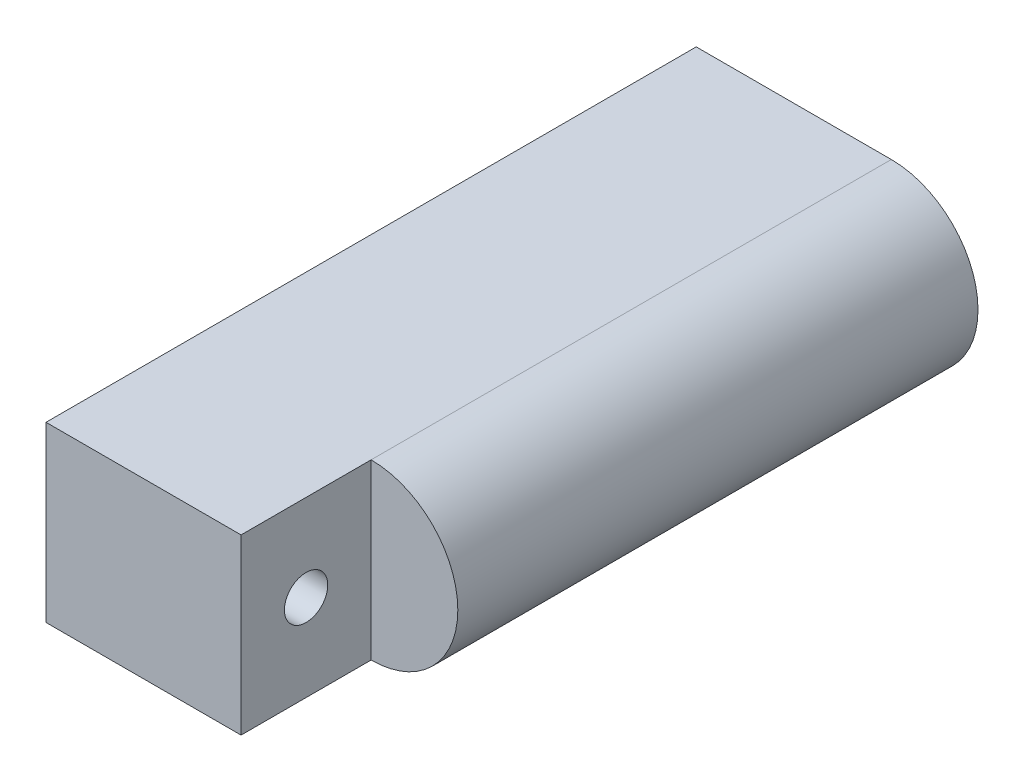
ISO-10303-21;
HEADER;
FILE_DESCRIPTION(('STEP AP214'),'2;1');
FILE_NAME('part.step','',(''),(''),'','','');
FILE_SCHEMA(('AUTOMOTIVE_DESIGN { 1 0 10303 214 1 1 1 1 }'));
ENDSEC;
DATA;
#1=APPLICATION_CONTEXT('core data for automotive mechanical design processes');
#2=APPLICATION_PROTOCOL_DEFINITION('international standard','automotive_design',2000,#1);
#3=PRODUCT_CONTEXT('',#1,'mechanical');
#4=PRODUCT('Part','Part','',(#3));
#5=PRODUCT_RELATED_PRODUCT_CATEGORY('part','',(#4));
#6=PRODUCT_DEFINITION_FORMATION('','',#4);
#7=PRODUCT_DEFINITION_CONTEXT('part definition',#1,'design');
#8=PRODUCT_DEFINITION('design','',#6,#7);
#9=PRODUCT_DEFINITION_SHAPE('','',#8);
#10=(LENGTH_UNIT() NAMED_UNIT(*) SI_UNIT(.MILLI.,.METRE.));
#11=(NAMED_UNIT(*) PLANE_ANGLE_UNIT() SI_UNIT($,.RADIAN.));
#12=(NAMED_UNIT(*) SI_UNIT($,.STERADIAN.) SOLID_ANGLE_UNIT());
#13=UNCERTAINTY_MEASURE_WITH_UNIT(LENGTH_MEASURE(1.E-05),#10,'distance_accuracy_value','');
#14=(GEOMETRIC_REPRESENTATION_CONTEXT(3) GLOBAL_UNCERTAINTY_ASSIGNED_CONTEXT((#13)) GLOBAL_UNIT_ASSIGNED_CONTEXT((#10,
#11,#12)) REPRESENTATION_CONTEXT('',''));
#15=CARTESIAN_POINT('',(0.,0.,0.));
#16=DIRECTION('',(0.,0.,1.));
#17=DIRECTION('',(1.,0.,0.));
#18=AXIS2_PLACEMENT_3D('',#15,#16,#17);
#19=CARTESIAN_POINT('',(22.5,0.,150.));
#20=DIRECTION('',(0.,0.,-1.));
#21=DIRECTION('',(-1.,0.,0.));
#22=AXIS2_PLACEMENT_3D('',#19,#20,#21);
#23=CYLINDRICAL_SURFACE('',#22,20.);
#24=DIRECTION('',(0.,0.,-1.));
#25=VECTOR('',#24,1.);
#26=CARTESIAN_POINT('',(22.5,20.,150.));
#27=LINE('',#26,#25);
#28=CARTESIAN_POINT('',(22.5,20.,120.));
#29=VERTEX_POINT('',#28);
#30=CARTESIAN_POINT('',(22.5,20.,0.));
#31=VERTEX_POINT('',#30);
#32=EDGE_CURVE('E103',#29,#31,#27,.T.);
#33=ORIENTED_EDGE('',*,*,#32,.F.);
#34=CARTESIAN_POINT('',(22.5,0.,120.));
#35=DIRECTION('',(0.,0.,-1.));
#36=DIRECTION('',(-1.,0.,0.));
#37=AXIS2_PLACEMENT_3D('',#34,#35,#36);
#38=CIRCLE('',#37,20.);
#39=CARTESIAN_POINT('',(22.5,-20.,120.));
#40=VERTEX_POINT('',#39);
#41=EDGE_CURVE('E11',#29,#40,#38,.T.);
#42=ORIENTED_EDGE('',*,*,#41,.T.);
#43=DIRECTION('',(0.,0.,-1.));
#44=VECTOR('',#43,1.);
#45=CARTESIAN_POINT('',(22.5,-20.,150.));
#46=LINE('',#45,#44);
#47=CARTESIAN_POINT('',(22.5,-20.,0.));
#48=VERTEX_POINT('',#47);
#49=EDGE_CURVE('E73',#40,#48,#46,.T.);
#50=ORIENTED_EDGE('',*,*,#49,.T.);
#51=CARTESIAN_POINT('',(22.5,0.,0.));
#52=DIRECTION('',(0.,0.,1.));
#53=DIRECTION('',(1.,0.,0.));
#54=AXIS2_PLACEMENT_3D('',#51,#52,#53);
#55=CIRCLE('',#54,20.);
#56=EDGE_CURVE('E101',#48,#31,#55,.T.);
#57=ORIENTED_EDGE('',*,*,#56,.T.);
#58=EDGE_LOOP('',(#33,#42,#50,#57));
#59=FACE_BOUND('',#58,.T.);
#60=ADVANCED_FACE('F33',(#59),#23,.T.);
#61=CARTESIAN_POINT('',(-22.5,20.,150.));
#62=DIRECTION('',(0.,-1.,0.));
#63=DIRECTION('',(0.,0.,-1.));
#64=AXIS2_PLACEMENT_3D('',#61,#62,#63);
#65=PLANE('',#64);
#66=DIRECTION('',(-1.,0.,0.));
#67=VECTOR('',#66,1.);
#68=CARTESIAN_POINT('',(-22.5,20.,0.));
#69=LINE('',#68,#67);
#70=CARTESIAN_POINT('',(-22.5,20.,0.));
#71=VERTEX_POINT('',#70);
#72=EDGE_CURVE('E121',#31,#71,#69,.T.);
#73=ORIENTED_EDGE('',*,*,#72,.T.);
#74=DIRECTION('',(0.,0.,-1.));
#75=VECTOR('',#74,1.);
#76=CARTESIAN_POINT('',(-22.5,20.,150.));
#77=LINE('',#76,#75);
#78=CARTESIAN_POINT('',(-22.5,20.,150.));
#79=VERTEX_POINT('',#78);
#80=EDGE_CURVE('E114',#79,#71,#77,.T.);
#81=ORIENTED_EDGE('',*,*,#80,.F.);
#82=DIRECTION('',(-1.,0.,0.));
#83=VECTOR('',#82,1.);
#84=CARTESIAN_POINT('',(-22.5,20.,150.));
#85=LINE('',#84,#83);
#86=CARTESIAN_POINT('',(22.5,20.,150.));
#87=VERTEX_POINT('',#86);
#88=EDGE_CURVE('E127',#87,#79,#85,.T.);
#89=ORIENTED_EDGE('',*,*,#88,.F.);
#90=EDGE_CURVE('E42',#87,#29,#27,.T.);
#91=ORIENTED_EDGE('',*,*,#90,.T.);
#92=ORIENTED_EDGE('',*,*,#32,.T.);
#93=EDGE_LOOP('',(#73,#81,#89,#91,#92));
#94=FACE_BOUND('',#93,.T.);
#95=ADVANCED_FACE('F119',(#94),#65,.F.);
#96=CARTESIAN_POINT('',(-22.5,-20.,150.));
#97=DIRECTION('',(1.,0.,0.));
#98=DIRECTION('',(0.,0.,-1.));
#99=AXIS2_PLACEMENT_3D('',#96,#97,#98);
#100=PLANE('',#99);
#101=CARTESIAN_POINT('',(-22.5,0.,135.));
#102=DIRECTION('',(-1.,0.,0.));
#103=DIRECTION('',(0.,0.,1.));
#104=AXIS2_PLACEMENT_3D('',#101,#102,#103);
#105=CIRCLE('',#104,4.99999999999999);
#106=CARTESIAN_POINT('',(-22.5,0.,140.));
#107=VERTEX_POINT('',#106);
#108=EDGE_CURVE('E131',#107,#107,#105,.T.);
#109=ORIENTED_EDGE('',*,*,#108,.F.);
#110=EDGE_LOOP('',(#109));
#111=FACE_BOUND('',#110,.T.);
#112=DIRECTION('',(0.,-1.,0.));
#113=VECTOR('',#112,1.);
#114=CARTESIAN_POINT('',(-22.5,-20.,0.));
#115=LINE('',#114,#113);
#116=CARTESIAN_POINT('',(-22.5,-20.,0.));
#117=VERTEX_POINT('',#116);
#118=EDGE_CURVE('E67',#71,#117,#115,.T.);
#119=ORIENTED_EDGE('',*,*,#118,.T.);
#120=DIRECTION('',(0.,0.,-1.));
#121=VECTOR('',#120,1.);
#122=CARTESIAN_POINT('',(-22.5,-20.,150.));
#123=LINE('',#122,#121);
#124=CARTESIAN_POINT('',(-22.5,-20.,150.));
#125=VERTEX_POINT('',#124);
#126=EDGE_CURVE('E97',#125,#117,#123,.T.);
#127=ORIENTED_EDGE('',*,*,#126,.F.);
#128=DIRECTION('',(0.,-1.,0.));
#129=VECTOR('',#128,1.);
#130=CARTESIAN_POINT('',(-22.5,-20.,150.));
#131=LINE('',#130,#129);
#132=EDGE_CURVE('E50',#79,#125,#131,.T.);
#133=ORIENTED_EDGE('',*,*,#132,.F.);
#134=ORIENTED_EDGE('',*,*,#80,.T.);
#135=EDGE_LOOP('',(#119,#127,#133,#134));
#136=FACE_BOUND('',#135,.T.);
#137=ADVANCED_FACE('F151',(#111,#136),#100,.F.);
#138=CARTESIAN_POINT('',(-22.5,-20.,150.));
#139=DIRECTION('',(0.,1.,0.));
#140=DIRECTION('',(0.,0.,1.));
#141=AXIS2_PLACEMENT_3D('',#138,#139,#140);
#142=PLANE('',#141);
#143=DIRECTION('',(1.,0.,0.));
#144=VECTOR('',#143,1.);
#145=CARTESIAN_POINT('',(-22.5,-20.,0.));
#146=LINE('',#145,#144);
#147=EDGE_CURVE('E106',#117,#48,#146,.T.);
#148=ORIENTED_EDGE('',*,*,#147,.T.);
#149=ORIENTED_EDGE('',*,*,#49,.F.);
#150=CARTESIAN_POINT('',(22.5,-20.,150.));
#151=VERTEX_POINT('',#150);
#152=EDGE_CURVE('E89',#151,#40,#46,.T.);
#153=ORIENTED_EDGE('',*,*,#152,.F.);
#154=DIRECTION('',(1.,0.,0.));
#155=VECTOR('',#154,1.);
#156=CARTESIAN_POINT('',(-22.5,-20.,150.));
#157=LINE('',#156,#155);
#158=EDGE_CURVE('E108',#125,#151,#157,.T.);
#159=ORIENTED_EDGE('',*,*,#158,.F.);
#160=ORIENTED_EDGE('',*,*,#126,.T.);
#161=EDGE_LOOP('',(#148,#149,#153,#159,#160));
#162=FACE_BOUND('',#161,.T.);
#163=ADVANCED_FACE('F104',(#162),#142,.F.);
#164=CARTESIAN_POINT('',(22.5,0.,150.));
#165=DIRECTION('',(0.,0.,1.));
#166=DIRECTION('',(1.,0.,0.));
#167=AXIS2_PLACEMENT_3D('',#164,#165,#166);
#168=PLANE('',#167);
#169=DIRECTION('',(0.,-1.,0.));
#170=VECTOR('',#169,1.);
#171=CARTESIAN_POINT('',(22.5,-20.,150.));
#172=LINE('',#171,#170);
#173=EDGE_CURVE('E94',#87,#151,#172,.T.);
#174=ORIENTED_EDGE('',*,*,#173,.F.);
#175=ORIENTED_EDGE('',*,*,#88,.T.);
#176=ORIENTED_EDGE('',*,*,#132,.T.);
#177=ORIENTED_EDGE('',*,*,#158,.T.);
#178=EDGE_LOOP('',(#174,#175,#176,#177));
#179=FACE_BOUND('',#178,.T.);
#180=ADVANCED_FACE('F160',(#179),#168,.T.);
#181=CARTESIAN_POINT('',(22.5,0.,0.));
#182=DIRECTION('',(0.,0.,1.));
#183=DIRECTION('',(1.,0.,0.));
#184=AXIS2_PLACEMENT_3D('',#181,#182,#183);
#185=PLANE('',#184);
#186=ORIENTED_EDGE('',*,*,#56,.F.);
#187=ORIENTED_EDGE('',*,*,#147,.F.);
#188=ORIENTED_EDGE('',*,*,#118,.F.);
#189=ORIENTED_EDGE('',*,*,#72,.F.);
#190=EDGE_LOOP('',(#186,#187,#188,#189));
#191=FACE_BOUND('',#190,.T.);
#192=ADVANCED_FACE('F123',(#191),#185,.F.);
#193=CARTESIAN_POINT('',(0.,0.,120.));
#194=DIRECTION('',(0.,0.,-1.));
#195=DIRECTION('',(-1.,0.,0.));
#196=AXIS2_PLACEMENT_3D('',#193,#194,#195);
#197=PLANE('',#196);
#198=DIRECTION('',(0.,-1.,0.));
#199=VECTOR('',#198,1.);
#200=CARTESIAN_POINT('',(22.5,-20.,120.));
#201=LINE('',#200,#199);
#202=EDGE_CURVE('E92',#29,#40,#201,.T.);
#203=ORIENTED_EDGE('',*,*,#202,.T.);
#204=ORIENTED_EDGE('',*,*,#41,.F.);
#205=EDGE_LOOP('',(#203,#204));
#206=FACE_BOUND('',#205,.T.);
#207=ADVANCED_FACE('F100',(#206),#197,.F.);
#208=CARTESIAN_POINT('',(22.5,-20.,120.));
#209=DIRECTION('',(-1.,0.,0.));
#210=DIRECTION('',(0.,0.,1.));
#211=AXIS2_PLACEMENT_3D('',#208,#209,#210);
#212=PLANE('',#211);
#213=CARTESIAN_POINT('',(22.5,0.,135.));
#214=DIRECTION('',(-1.,0.,0.));
#215=DIRECTION('',(0.,0.,1.));
#216=AXIS2_PLACEMENT_3D('',#213,#214,#215);
#217=CIRCLE('',#216,4.99999999999999);
#218=CARTESIAN_POINT('',(22.5,0.,140.));
#219=VERTEX_POINT('',#218);
#220=EDGE_CURVE('E36',#219,#219,#217,.T.);
#221=ORIENTED_EDGE('',*,*,#220,.T.);
#222=EDGE_LOOP('',(#221));
#223=FACE_BOUND('',#222,.T.);
#224=ORIENTED_EDGE('',*,*,#173,.T.);
#225=ORIENTED_EDGE('',*,*,#152,.T.);
#226=ORIENTED_EDGE('',*,*,#202,.F.);
#227=ORIENTED_EDGE('',*,*,#90,.F.);
#228=EDGE_LOOP('',(#224,#225,#226,#227));
#229=FACE_BOUND('',#228,.T.);
#230=ADVANCED_FACE('F91',(#223,#229),#212,.F.);
#231=CARTESIAN_POINT('',(29.5,0.,135.));
#232=DIRECTION('',(-1.,0.,0.));
#233=DIRECTION('',(0.,0.,1.));
#234=AXIS2_PLACEMENT_3D('',#231,#232,#233);
#235=CYLINDRICAL_SURFACE('',#234,4.99999999999999);
#236=CARTESIAN_POINT('',(-22.5,0.,140.));
#237=CARTESIAN_POINT('',(-22.03125,0.,140.));
#238=CARTESIAN_POINT('',(-21.5625,0.,140.));
#239=CARTESIAN_POINT('',(-20.625,0.,140.));
#240=CARTESIAN_POINT('',(-20.15625,0.,140.));
#241=CARTESIAN_POINT('',(-19.21875,0.,140.));
#242=CARTESIAN_POINT('',(-18.75,0.,140.));
#243=CARTESIAN_POINT('',(-17.8125,0.,140.));
#244=CARTESIAN_POINT('',(-17.34375,0.,140.));
#245=CARTESIAN_POINT('',(-16.40625,0.,140.));
#246=CARTESIAN_POINT('',(-15.9375,0.,140.));
#247=CARTESIAN_POINT('',(-15.,0.,140.));
#248=CARTESIAN_POINT('',(-14.53125,0.,140.));
#249=CARTESIAN_POINT('',(-13.59375,0.,140.));
#250=CARTESIAN_POINT('',(-13.125,0.,140.));
#251=CARTESIAN_POINT('',(-12.1875,0.,140.));
#252=CARTESIAN_POINT('',(-11.71875,0.,140.));
#253=CARTESIAN_POINT('',(-10.78125,0.,140.));
#254=CARTESIAN_POINT('',(-10.3125,0.,140.));
#255=CARTESIAN_POINT('',(-9.37499999999999,0.,140.));
#256=CARTESIAN_POINT('',(-8.90624999999999,0.,140.));
#257=CARTESIAN_POINT('',(-7.96874999999999,0.,140.));
#258=CARTESIAN_POINT('',(-7.49999999999999,0.,140.));
#259=CARTESIAN_POINT('',(-6.56249999999999,0.,140.));
#260=CARTESIAN_POINT('',(-6.09374999999999,0.,140.));
#261=CARTESIAN_POINT('',(-5.15624999999999,0.,140.));
#262=CARTESIAN_POINT('',(-4.68749999999999,0.,140.));
#263=CARTESIAN_POINT('',(-3.74999999999999,0.,140.));
#264=CARTESIAN_POINT('',(-3.28124999999999,0.,140.));
#265=CARTESIAN_POINT('',(-2.34375,0.,140.));
#266=CARTESIAN_POINT('',(-1.875,0.,140.));
#267=CARTESIAN_POINT('',(-0.937499999999997,0.,140.));
#268=CARTESIAN_POINT('',(-0.468749999999997,0.,140.));
#269=CARTESIAN_POINT('',(0.468750000000004,0.,140.));
#270=CARTESIAN_POINT('',(0.937500000000004,0.,140.));
#271=CARTESIAN_POINT('',(1.875,0.,140.));
#272=CARTESIAN_POINT('',(2.34375,0.,140.));
#273=CARTESIAN_POINT('',(3.28125,0.,140.));
#274=CARTESIAN_POINT('',(3.75,0.,140.));
#275=CARTESIAN_POINT('',(4.6875,0.,140.));
#276=CARTESIAN_POINT('',(5.15625,0.,140.));
#277=CARTESIAN_POINT('',(6.09375,0.,140.));
#278=CARTESIAN_POINT('',(6.5625,0.,140.));
#279=CARTESIAN_POINT('',(7.5,0.,140.));
#280=CARTESIAN_POINT('',(7.96875,0.,140.));
#281=CARTESIAN_POINT('',(8.90625,0.,140.));
#282=CARTESIAN_POINT('',(9.375,0.,140.));
#283=CARTESIAN_POINT('',(10.3125,0.,140.));
#284=CARTESIAN_POINT('',(10.78125,0.,140.));
#285=CARTESIAN_POINT('',(11.71875,0.,140.));
#286=CARTESIAN_POINT('',(12.1875,0.,140.));
#287=CARTESIAN_POINT('',(13.125,0.,140.));
#288=CARTESIAN_POINT('',(13.59375,0.,140.));
#289=CARTESIAN_POINT('',(14.53125,0.,140.));
#290=CARTESIAN_POINT('',(15.,0.,140.));
#291=CARTESIAN_POINT('',(15.9375,0.,140.));
#292=CARTESIAN_POINT('',(16.40625,0.,140.));
#293=CARTESIAN_POINT('',(17.34375,0.,140.));
#294=CARTESIAN_POINT('',(17.8125,0.,140.));
#295=CARTESIAN_POINT('',(18.75,0.,140.));
#296=CARTESIAN_POINT('',(19.21875,0.,140.));
#297=CARTESIAN_POINT('',(20.15625,0.,140.));
#298=CARTESIAN_POINT('',(20.625,0.,140.));
#299=CARTESIAN_POINT('',(21.5625,0.,140.));
#300=CARTESIAN_POINT('',(22.03125,0.,140.));
#301=CARTESIAN_POINT('',(22.5,0.,140.));
#302=B_SPLINE_CURVE_WITH_KNOTS('',3,(#236,#237,#238,#239,#240,#241,#242,#243,#244,#245,#246,
#247,#248,#249,#250,#251,#252,#253,#254,#255,#256,#257,#258,#259,#260,#261,#262,#263,#264,#265,
#266,#267,#268,#269,#270,#271,#272,#273,#274,#275,#276,#277,#278,#279,#280,#281,#282,#283,#284,
#285,#286,#287,#288,#289,#290,#291,#292,#293,#294,#295,#296,#297,#298,#299,#300,#301),
.UNSPECIFIED.,.F.,.F.,(4,2,2,2,2,2,2,2,2,2,2,2,2,2,2,2,2,2,2,2,2,2,2,2,2,2,2,2,2,2,2,2,4),(0.,
1.40625,2.8125,4.21875,5.625,7.03125,8.4375,9.84375,11.25,12.65625,14.0625,15.46875,16.875,
18.28125,19.6875,21.09375,22.5,23.90625,25.3125,26.71875,28.125,29.53125,30.9375,32.34375,33.75,
35.15625,36.5625,37.96875,39.375,40.78125,42.1875,43.59375,45.),.UNSPECIFIED.);
#303=EDGE_CURVE('BSEAM139',#107,#219,#302,.T.);
#304=ORIENTED_EDGE('',*,*,#108,.T.);
#305=ORIENTED_EDGE('',*,*,#220,.F.);
#306=ORIENTED_EDGE('',*,*,#303,.T.);
#307=ORIENTED_EDGE('',*,*,#303,.F.);
#308=EDGE_LOOP('',(#304,#306,#305,#307));
#309=FACE_BOUND('',#308,.T.);
#310=ADVANCED_FACE('F139',(#309),#235,.F.);
#311=CLOSED_SHELL('',(#60,#95,#137,#163,#180,#192,#207,#230,#310));
#312=MANIFOLD_SOLID_BREP('B2',#311);
#313=ADVANCED_BREP_SHAPE_REPRESENTATION('',(#18,#312),#14);
#314=SHAPE_DEFINITION_REPRESENTATION(#9,#313);
ENDSEC;
END-ISO-10303-21;
